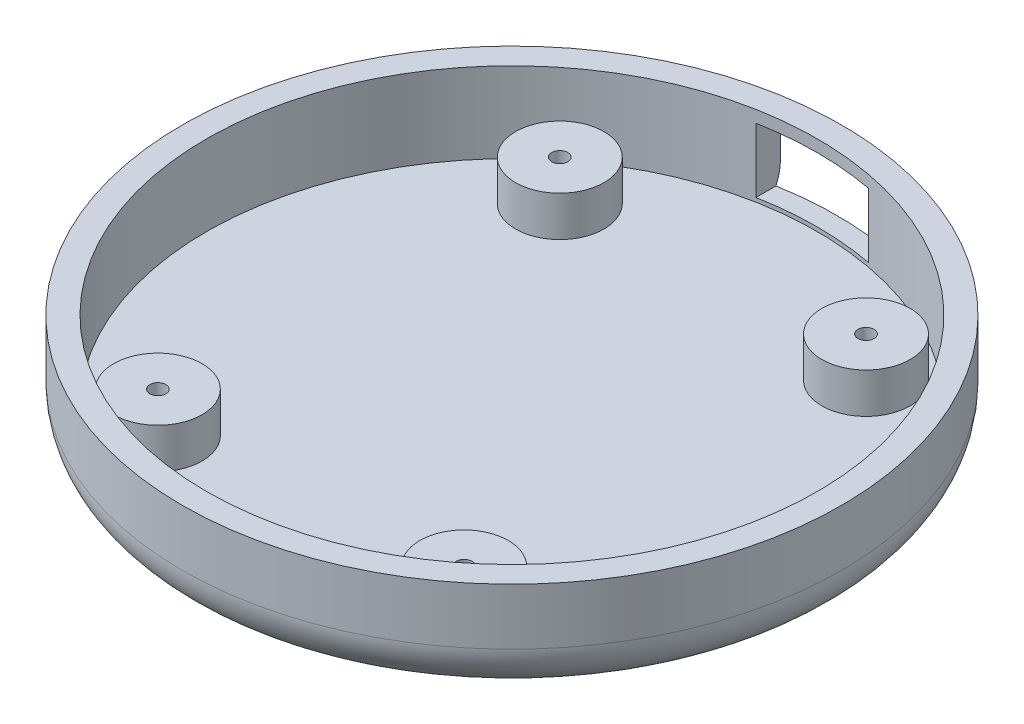
ISO-10303-21;
HEADER;
FILE_DESCRIPTION(('STEP AP214'),'2;1');
FILE_NAME('part.step','',(''),(''),'','','');
FILE_SCHEMA(('AUTOMOTIVE_DESIGN { 1 0 10303 214 1 1 1 1 }'));
ENDSEC;
DATA;
#1=APPLICATION_CONTEXT('core data for automotive mechanical design processes');
#2=APPLICATION_PROTOCOL_DEFINITION('international standard','automotive_design',2000,#1);
#3=PRODUCT_CONTEXT('',#1,'mechanical');
#4=PRODUCT('Part','Part','',(#3));
#5=PRODUCT_RELATED_PRODUCT_CATEGORY('part','',(#4));
#6=PRODUCT_DEFINITION_FORMATION('','',#4);
#7=PRODUCT_DEFINITION_CONTEXT('part definition',#1,'design');
#8=PRODUCT_DEFINITION('design','',#6,#7);
#9=PRODUCT_DEFINITION_SHAPE('','',#8);
#10=(LENGTH_UNIT() NAMED_UNIT(*) SI_UNIT(.MILLI.,.METRE.));
#11=(NAMED_UNIT(*) PLANE_ANGLE_UNIT() SI_UNIT($,.RADIAN.));
#12=(NAMED_UNIT(*) SI_UNIT($,.STERADIAN.) SOLID_ANGLE_UNIT());
#13=UNCERTAINTY_MEASURE_WITH_UNIT(LENGTH_MEASURE(1.E-05),#10,'distance_accuracy_value','');
#14=(GEOMETRIC_REPRESENTATION_CONTEXT(3) GLOBAL_UNCERTAINTY_ASSIGNED_CONTEXT((#13)) GLOBAL_UNIT_ASSIGNED_CONTEXT((#10,
#11,#12)) REPRESENTATION_CONTEXT('',''));
#15=CARTESIAN_POINT('',(0.,0.,0.));
#16=DIRECTION('',(0.,0.,1.));
#17=DIRECTION('',(1.,0.,0.));
#18=AXIS2_PLACEMENT_3D('',#15,#16,#17);
#19=CARTESIAN_POINT('',(0.,3.,0.));
#20=DIRECTION('',(0.,1.,0.));
#21=DIRECTION('',(0.,0.,1.));
#22=AXIS2_PLACEMENT_3D('',#19,#20,#21);
#23=PLANE('',#22);
#24=CARTESIAN_POINT('',(19.0500000000005,3.,25.));
#25=DIRECTION('',(0.,1.,0.));
#26=DIRECTION('',(0.,0.,1.));
#27=AXIS2_PLACEMENT_3D('',#24,#25,#26);
#28=CIRCLE('',#27,5.5);
#29=CARTESIAN_POINT('',(19.0500000000005,3.,30.5));
#30=VERTEX_POINT('',#29);
#31=EDGE_CURVE('E148',#30,#30,#28,.T.);
#32=ORIENTED_EDGE('',*,*,#31,.F.);
#33=EDGE_LOOP('',(#32));
#34=FACE_BOUND('',#33,.T.);
#35=CARTESIAN_POINT('',(-19.0499999999995,3.,25.));
#36=DIRECTION('',(0.,1.,0.));
#37=DIRECTION('',(0.,0.,1.));
#38=AXIS2_PLACEMENT_3D('',#35,#36,#37);
#39=CIRCLE('',#38,5.5);
#40=CARTESIAN_POINT('',(-19.0499999999995,3.,30.5));
#41=VERTEX_POINT('',#40);
#42=EDGE_CURVE('E152',#41,#41,#39,.T.);
#43=ORIENTED_EDGE('',*,*,#42,.F.);
#44=EDGE_LOOP('',(#43));
#45=FACE_BOUND('',#44,.T.);
#46=CARTESIAN_POINT('',(19.05,3.,-25.));
#47=DIRECTION('',(0.,1.,0.));
#48=DIRECTION('',(0.,0.,1.));
#49=AXIS2_PLACEMENT_3D('',#46,#47,#48);
#50=CIRCLE('',#49,5.5);
#51=CARTESIAN_POINT('',(19.05,3.,-19.5));
#52=VERTEX_POINT('',#51);
#53=EDGE_CURVE('E158',#52,#52,#50,.T.);
#54=ORIENTED_EDGE('',*,*,#53,.F.);
#55=EDGE_LOOP('',(#54));
#56=FACE_BOUND('',#55,.T.);
#57=CARTESIAN_POINT('',(-19.05,3.,-25.));
#58=DIRECTION('',(0.,1.,0.));
#59=DIRECTION('',(0.,0.,1.));
#60=AXIS2_PLACEMENT_3D('',#57,#58,#59);
#61=CIRCLE('',#60,5.5);
#62=CARTESIAN_POINT('',(-19.05,3.,-19.5));
#63=VERTEX_POINT('',#62);
#64=EDGE_CURVE('E164',#63,#63,#61,.T.);
#65=ORIENTED_EDGE('',*,*,#64,.F.);
#66=EDGE_LOOP('',(#65));
#67=FACE_BOUND('',#66,.T.);
#68=CARTESIAN_POINT('',(0.,3.,0.));
#69=DIRECTION('',(0.,1.,0.));
#70=DIRECTION('',(0.,0.,1.));
#71=AXIS2_PLACEMENT_3D('',#68,#69,#70);
#72=CIRCLE('',#71,38.);
#73=CARTESIAN_POINT('',(0.,3.,38.));
#74=VERTEX_POINT('',#73);
#75=EDGE_CURVE('E190',#74,#74,#72,.F.);
#76=ORIENTED_EDGE('',*,*,#75,.F.);
#77=EDGE_LOOP('',(#76));
#78=FACE_BOUND('',#77,.T.);
#79=ADVANCED_FACE('F33',(#34,#45,#56,#67,#78),#23,.T.);
#80=CARTESIAN_POINT('',(0.,0.,0.));
#81=DIRECTION('',(0.,1.,0.));
#82=DIRECTION('',(0.,0.,1.));
#83=AXIS2_PLACEMENT_3D('',#80,#81,#82);
#84=PLANE('',#83);
#85=CARTESIAN_POINT('',(0.,0.,0.));
#86=DIRECTION('',(0.,1.,0.));
#87=DIRECTION('',(0.,0.,1.));
#88=AXIS2_PLACEMENT_3D('',#85,#86,#87);
#89=CIRCLE('',#88,35.);
#90=CARTESIAN_POINT('',(0.,0.,35.));
#91=VERTEX_POINT('',#90);
#92=EDGE_CURVE('E195',#91,#91,#89,.F.);
#93=ORIENTED_EDGE('',*,*,#92,.T.);
#94=EDGE_LOOP('',(#93));
#95=FACE_BOUND('',#94,.T.);
#96=CARTESIAN_POINT('',(-19.05,0.,-25.));
#97=DIRECTION('',(0.,1.,0.));
#98=DIRECTION('',(0.,0.,1.));
#99=AXIS2_PLACEMENT_3D('',#96,#97,#98);
#100=CIRCLE('',#99,2.5);
#101=CARTESIAN_POINT('',(-19.05,0.,-22.5));
#102=VERTEX_POINT('',#101);
#103=EDGE_CURVE('E187',#102,#102,#100,.T.);
#104=ORIENTED_EDGE('',*,*,#103,.T.);
#105=EDGE_LOOP('',(#104));
#106=FACE_BOUND('',#105,.T.);
#107=CARTESIAN_POINT('',(19.05,0.,-25.));
#108=DIRECTION('',(0.,1.,0.));
#109=DIRECTION('',(0.,0.,1.));
#110=AXIS2_PLACEMENT_3D('',#107,#108,#109);
#111=CIRCLE('',#110,2.5);
#112=CARTESIAN_POINT('',(19.05,0.,-22.5));
#113=VERTEX_POINT('',#112);
#114=EDGE_CURVE('E184',#113,#113,#111,.T.);
#115=ORIENTED_EDGE('',*,*,#114,.T.);
#116=EDGE_LOOP('',(#115));
#117=FACE_BOUND('',#116,.T.);
#118=CARTESIAN_POINT('',(19.0500000000005,0.,25.));
#119=DIRECTION('',(0.,1.,0.));
#120=DIRECTION('',(0.,0.,1.));
#121=AXIS2_PLACEMENT_3D('',#118,#119,#120);
#122=CIRCLE('',#121,2.5);
#123=CARTESIAN_POINT('',(19.0500000000005,0.,27.5));
#124=VERTEX_POINT('',#123);
#125=EDGE_CURVE('E181',#124,#124,#122,.T.);
#126=ORIENTED_EDGE('',*,*,#125,.T.);
#127=EDGE_LOOP('',(#126));
#128=FACE_BOUND('',#127,.T.);
#129=CARTESIAN_POINT('',(-19.0499999999995,0.,25.));
#130=DIRECTION('',(0.,1.,0.));
#131=DIRECTION('',(0.,0.,1.));
#132=AXIS2_PLACEMENT_3D('',#129,#130,#131);
#133=CIRCLE('',#132,2.5);
#134=CARTESIAN_POINT('',(-19.0499999999995,0.,27.5));
#135=VERTEX_POINT('',#134);
#136=EDGE_CURVE('E178',#135,#135,#133,.T.);
#137=ORIENTED_EDGE('',*,*,#136,.T.);
#138=EDGE_LOOP('',(#137));
#139=FACE_BOUND('',#138,.T.);
#140=ADVANCED_FACE('F232',(#95,#106,#117,#128,#139),#84,.F.);
#141=CARTESIAN_POINT('',(0.,3.,0.));
#142=DIRECTION('',(0.,-1.,0.));
#143=DIRECTION('',(0.,0.,-1.));
#144=AXIS2_PLACEMENT_3D('',#141,#142,#143);
#145=CYLINDRICAL_SURFACE('',#144,41.);
#146=CARTESIAN_POINT('',(0.,6.,0.));
#147=DIRECTION('',(0.,1.,0.));
#148=DIRECTION('',(0.,0.,1.));
#149=AXIS2_PLACEMENT_3D('',#146,#147,#148);
#150=CIRCLE('',#149,41.);
#151=CARTESIAN_POINT('',(-7.,6.,-40.3980197534483));
#152=VERTEX_POINT('',#151);
#153=CARTESIAN_POINT('',(7.,6.,-40.3980197534483));
#154=VERTEX_POINT('',#153);
#155=EDGE_CURVE('E193',#152,#154,#150,.T.);
#156=ORIENTED_EDGE('',*,*,#155,.T.);
#157=DIRECTION('',(0.,-1.,0.));
#158=VECTOR('',#157,1.);
#159=CARTESIAN_POINT('',(7.,3.,-40.3980197534483));
#160=LINE('',#159,#158);
#161=CARTESIAN_POINT('',(7.,11.5,-40.3980197534483));
#162=VERTEX_POINT('',#161);
#163=EDGE_CURVE('E87',#154,#162,#160,.F.);
#164=ORIENTED_EDGE('',*,*,#163,.T.);
#165=CARTESIAN_POINT('',(0.,11.5,0.));
#166=DIRECTION('',(0.,1.,0.));
#167=DIRECTION('',(0.,0.,1.));
#168=AXIS2_PLACEMENT_3D('',#165,#166,#167);
#169=CIRCLE('',#168,41.);
#170=CARTESIAN_POINT('',(-7.,11.5,-40.3980197534483));
#171=VERTEX_POINT('',#170);
#172=EDGE_CURVE('E80',#162,#171,#169,.T.);
#173=ORIENTED_EDGE('',*,*,#172,.T.);
#174=DIRECTION('',(0.,-1.,0.));
#175=VECTOR('',#174,1.);
#176=CARTESIAN_POINT('',(-7.,3.,-40.3980197534483));
#177=LINE('',#176,#175);
#178=EDGE_CURVE('E85',#171,#152,#177,.T.);
#179=ORIENTED_EDGE('',*,*,#178,.T.);
#180=EDGE_LOOP('',(#156,#164,#173,#179));
#181=FACE_BOUND('',#180,.T.);
#182=CARTESIAN_POINT('',(0.,13.,0.));
#183=DIRECTION('',(0.,1.,0.));
#184=DIRECTION('',(0.,0.,1.));
#185=AXIS2_PLACEMENT_3D('',#182,#183,#184);
#186=CIRCLE('',#185,41.);
#187=CARTESIAN_POINT('',(0.,13.,41.));
#188=VERTEX_POINT('',#187);
#189=EDGE_CURVE('E175',#188,#188,#186,.T.);
#190=ORIENTED_EDGE('',*,*,#189,.F.);
#191=EDGE_LOOP('',(#190));
#192=FACE_BOUND('',#191,.T.);
#193=ADVANCED_FACE('F83',(#181,#192),#145,.T.);
#194=CARTESIAN_POINT('',(-19.05,3.,-25.));
#195=DIRECTION('',(0.,-1.,0.));
#196=DIRECTION('',(0.,0.,-1.));
#197=AXIS2_PLACEMENT_3D('',#194,#195,#196);
#198=CYLINDRICAL_SURFACE('',#197,2.5);
#199=ORIENTED_EDGE('',*,*,#103,.F.);
#200=EDGE_LOOP('',(#199));
#201=FACE_BOUND('',#200,.T.);
#202=CARTESIAN_POINT('',(-19.05,6.,-25.));
#203=DIRECTION('',(0.,1.,0.));
#204=DIRECTION('',(0.,0.,1.));
#205=AXIS2_PLACEMENT_3D('',#202,#203,#204);
#206=CIRCLE('',#205,2.5);
#207=CARTESIAN_POINT('',(-19.05,6.,-22.5));
#208=VERTEX_POINT('',#207);
#209=EDGE_CURVE('E167',#208,#208,#206,.F.);
#210=ORIENTED_EDGE('',*,*,#209,.F.);
#211=EDGE_LOOP('',(#210));
#212=FACE_BOUND('',#211,.T.);
#213=ADVANCED_FACE('F275',(#201,#212),#198,.F.);
#214=CARTESIAN_POINT('',(19.05,3.,-25.));
#215=DIRECTION('',(0.,-1.,0.));
#216=DIRECTION('',(0.,0.,-1.));
#217=AXIS2_PLACEMENT_3D('',#214,#215,#216);
#218=CYLINDRICAL_SURFACE('',#217,2.5);
#219=ORIENTED_EDGE('',*,*,#114,.F.);
#220=EDGE_LOOP('',(#219));
#221=FACE_BOUND('',#220,.T.);
#222=CARTESIAN_POINT('',(19.05,6.,-25.));
#223=DIRECTION('',(0.,1.,0.));
#224=DIRECTION('',(0.,0.,1.));
#225=AXIS2_PLACEMENT_3D('',#222,#223,#224);
#226=CIRCLE('',#225,2.5);
#227=CARTESIAN_POINT('',(19.05,6.,-22.5));
#228=VERTEX_POINT('',#227);
#229=EDGE_CURVE('E161',#228,#228,#226,.F.);
#230=ORIENTED_EDGE('',*,*,#229,.F.);
#231=EDGE_LOOP('',(#230));
#232=FACE_BOUND('',#231,.T.);
#233=ADVANCED_FACE('F282',(#221,#232),#218,.F.);
#234=CARTESIAN_POINT('',(19.0500000000005,3.,25.));
#235=DIRECTION('',(0.,-1.,0.));
#236=DIRECTION('',(0.,0.,-1.));
#237=AXIS2_PLACEMENT_3D('',#234,#235,#236);
#238=CYLINDRICAL_SURFACE('',#237,2.5);
#239=ORIENTED_EDGE('',*,*,#125,.F.);
#240=EDGE_LOOP('',(#239));
#241=FACE_BOUND('',#240,.T.);
#242=CARTESIAN_POINT('',(19.0500000000005,6.,25.));
#243=DIRECTION('',(0.,1.,0.));
#244=DIRECTION('',(0.,0.,1.));
#245=AXIS2_PLACEMENT_3D('',#242,#243,#244);
#246=CIRCLE('',#245,2.5);
#247=CARTESIAN_POINT('',(19.0500000000005,6.,27.5));
#248=VERTEX_POINT('',#247);
#249=EDGE_CURVE('E149',#248,#248,#246,.F.);
#250=ORIENTED_EDGE('',*,*,#249,.F.);
#251=EDGE_LOOP('',(#250));
#252=FACE_BOUND('',#251,.T.);
#253=ADVANCED_FACE('F248',(#241,#252),#238,.F.);
#254=CARTESIAN_POINT('',(-19.0499999999995,3.,25.));
#255=DIRECTION('',(0.,-1.,0.));
#256=DIRECTION('',(0.,0.,-1.));
#257=AXIS2_PLACEMENT_3D('',#254,#255,#256);
#258=CYLINDRICAL_SURFACE('',#257,2.5);
#259=ORIENTED_EDGE('',*,*,#136,.F.);
#260=EDGE_LOOP('',(#259));
#261=FACE_BOUND('',#260,.T.);
#262=CARTESIAN_POINT('',(-19.0499999999995,6.,25.));
#263=DIRECTION('',(0.,1.,0.));
#264=DIRECTION('',(0.,0.,1.));
#265=AXIS2_PLACEMENT_3D('',#262,#263,#264);
#266=CIRCLE('',#265,2.5);
#267=CARTESIAN_POINT('',(-19.0499999999995,6.,27.5));
#268=VERTEX_POINT('',#267);
#269=EDGE_CURVE('E155',#268,#268,#266,.F.);
#270=ORIENTED_EDGE('',*,*,#269,.F.);
#271=EDGE_LOOP('',(#270));
#272=FACE_BOUND('',#271,.T.);
#273=ADVANCED_FACE('F244',(#261,#272),#258,.F.);
#274=CARTESIAN_POINT('',(0.,13.,0.));
#275=DIRECTION('',(0.,-1.,0.));
#276=DIRECTION('',(0.,0.,-1.));
#277=AXIS2_PLACEMENT_3D('',#274,#275,#276);
#278=CYLINDRICAL_SURFACE('',#277,38.);
#279=DIRECTION('',(0.,-1.,0.));
#280=VECTOR('',#279,1.);
#281=CARTESIAN_POINT('',(7.,13.,-37.3496987939662));
#282=LINE('',#281,#280);
#283=CARTESIAN_POINT('',(7.,3.5,-37.3496987939662));
#284=VERTEX_POINT('',#283);
#285=CARTESIAN_POINT('',(7.,11.5,-37.3496987939662));
#286=VERTEX_POINT('',#285);
#287=EDGE_CURVE('E90',#284,#286,#282,.F.);
#288=ORIENTED_EDGE('',*,*,#287,.F.);
#289=CARTESIAN_POINT('',(0.,3.5,0.));
#290=DIRECTION('',(0.,-1.,0.));
#291=DIRECTION('',(1.,0.,0.));
#292=AXIS2_PLACEMENT_3D('',#289,#290,#291);
#293=CIRCLE('',#292,38.);
#294=CARTESIAN_POINT('',(-7.,3.50000000000001,-37.3496987939662));
#295=VERTEX_POINT('',#294);
#296=EDGE_CURVE('E109',#295,#284,#293,.T.);
#297=ORIENTED_EDGE('',*,*,#296,.F.);
#298=DIRECTION('',(0.,-1.,0.));
#299=VECTOR('',#298,1.);
#300=CARTESIAN_POINT('',(-7.,13.,-37.3496987939662));
#301=LINE('',#300,#299);
#302=CARTESIAN_POINT('',(-7.,11.5,-37.3496987939662));
#303=VERTEX_POINT('',#302);
#304=EDGE_CURVE('E98',#303,#295,#301,.T.);
#305=ORIENTED_EDGE('',*,*,#304,.F.);
#306=CARTESIAN_POINT('',(0.,11.5,0.));
#307=DIRECTION('',(0.,1.,0.));
#308=DIRECTION('',(0.,0.,1.));
#309=AXIS2_PLACEMENT_3D('',#306,#307,#308);
#310=CIRCLE('',#309,38.);
#311=EDGE_CURVE('E11',#286,#303,#310,.T.);
#312=ORIENTED_EDGE('',*,*,#311,.F.);
#313=EDGE_LOOP('',(#288,#297,#305,#312));
#314=FACE_BOUND('',#313,.T.);
#315=CARTESIAN_POINT('',(0.,13.,0.));
#316=DIRECTION('',(0.,1.,0.));
#317=DIRECTION('',(0.,0.,1.));
#318=AXIS2_PLACEMENT_3D('',#315,#316,#317);
#319=CIRCLE('',#318,38.);
#320=CARTESIAN_POINT('',(0.,13.,38.));
#321=VERTEX_POINT('',#320);
#322=EDGE_CURVE('E170',#321,#321,#319,.T.);
#323=ORIENTED_EDGE('',*,*,#322,.T.);
#324=EDGE_LOOP('',(#323));
#325=FACE_BOUND('',#324,.T.);
#326=ORIENTED_EDGE('',*,*,#75,.T.);
#327=EDGE_LOOP('',(#326));
#328=FACE_BOUND('',#327,.T.);
#329=ADVANCED_FACE('F247',(#314,#325,#328),#278,.F.);
#330=CARTESIAN_POINT('',(0.,13.,0.));
#331=DIRECTION('',(0.,1.,0.));
#332=DIRECTION('',(0.,0.,1.));
#333=AXIS2_PLACEMENT_3D('',#330,#331,#332);
#334=PLANE('',#333);
#335=ORIENTED_EDGE('',*,*,#322,.F.);
#336=EDGE_LOOP('',(#335));
#337=FACE_BOUND('',#336,.T.);
#338=ORIENTED_EDGE('',*,*,#189,.T.);
#339=EDGE_LOOP('',(#338));
#340=FACE_BOUND('',#339,.T.);
#341=ADVANCED_FACE('F319',(#337,#340),#334,.T.);
#342=CARTESIAN_POINT('',(-19.05,6.,-25.));
#343=DIRECTION('',(0.,-1.,0.));
#344=DIRECTION('',(0.,0.,-1.));
#345=AXIS2_PLACEMENT_3D('',#342,#343,#344);
#346=CYLINDRICAL_SURFACE('',#345,5.5);
#347=ORIENTED_EDGE('',*,*,#64,.T.);
#348=EDGE_LOOP('',(#347));
#349=FACE_BOUND('',#348,.T.);
#350=CARTESIAN_POINT('',(-19.05,8.,-25.));
#351=DIRECTION('',(0.,1.,0.));
#352=DIRECTION('',(0.,0.,1.));
#353=AXIS2_PLACEMENT_3D('',#350,#351,#352);
#354=CIRCLE('',#353,5.5);
#355=CARTESIAN_POINT('',(-19.05,8.,-19.5));
#356=VERTEX_POINT('',#355);
#357=EDGE_CURVE('E143',#356,#356,#354,.T.);
#358=ORIENTED_EDGE('',*,*,#357,.F.);
#359=EDGE_LOOP('',(#358));
#360=FACE_BOUND('',#359,.T.);
#361=ADVANCED_FACE('F315',(#349,#360),#346,.T.);
#362=CARTESIAN_POINT('',(19.05,6.,-25.));
#363=DIRECTION('',(0.,-1.,0.));
#364=DIRECTION('',(0.,0.,-1.));
#365=AXIS2_PLACEMENT_3D('',#362,#363,#364);
#366=CYLINDRICAL_SURFACE('',#365,5.5);
#367=ORIENTED_EDGE('',*,*,#53,.T.);
#368=EDGE_LOOP('',(#367));
#369=FACE_BOUND('',#368,.T.);
#370=CARTESIAN_POINT('',(19.05,8.,-25.));
#371=DIRECTION('',(0.,1.,0.));
#372=DIRECTION('',(0.,0.,1.));
#373=AXIS2_PLACEMENT_3D('',#370,#371,#372);
#374=CIRCLE('',#373,5.5);
#375=CARTESIAN_POINT('',(19.05,8.,-19.5));
#376=VERTEX_POINT('',#375);
#377=EDGE_CURVE('E134',#376,#376,#374,.T.);
#378=ORIENTED_EDGE('',*,*,#377,.F.);
#379=EDGE_LOOP('',(#378));
#380=FACE_BOUND('',#379,.T.);
#381=ADVANCED_FACE('F311',(#369,#380),#366,.T.);
#382=CARTESIAN_POINT('',(-19.0499999999995,6.,25.));
#383=DIRECTION('',(0.,-1.,0.));
#384=DIRECTION('',(0.,0.,-1.));
#385=AXIS2_PLACEMENT_3D('',#382,#383,#384);
#386=CYLINDRICAL_SURFACE('',#385,5.5);
#387=ORIENTED_EDGE('',*,*,#42,.T.);
#388=EDGE_LOOP('',(#387));
#389=FACE_BOUND('',#388,.T.);
#390=CARTESIAN_POINT('',(-19.0499999999995,8.,25.));
#391=DIRECTION('',(0.,1.,0.));
#392=DIRECTION('',(0.,0.,1.));
#393=AXIS2_PLACEMENT_3D('',#390,#391,#392);
#394=CIRCLE('',#393,5.5);
#395=CARTESIAN_POINT('',(-19.0499999999995,8.,30.5));
#396=VERTEX_POINT('',#395);
#397=EDGE_CURVE('E116',#396,#396,#394,.T.);
#398=ORIENTED_EDGE('',*,*,#397,.F.);
#399=EDGE_LOOP('',(#398));
#400=FACE_BOUND('',#399,.T.);
#401=ADVANCED_FACE('F304',(#389,#400),#386,.T.);
#402=CARTESIAN_POINT('',(19.0500000000005,6.,25.));
#403=DIRECTION('',(0.,-1.,0.));
#404=DIRECTION('',(0.,0.,-1.));
#405=AXIS2_PLACEMENT_3D('',#402,#403,#404);
#406=CYLINDRICAL_SURFACE('',#405,5.5);
#407=ORIENTED_EDGE('',*,*,#31,.T.);
#408=EDGE_LOOP('',(#407));
#409=FACE_BOUND('',#408,.T.);
#410=CARTESIAN_POINT('',(19.0500000000005,8.,25.));
#411=DIRECTION('',(0.,1.,0.));
#412=DIRECTION('',(0.,0.,1.));
#413=AXIS2_PLACEMENT_3D('',#410,#411,#412);
#414=CIRCLE('',#413,5.5);
#415=CARTESIAN_POINT('',(19.0500000000005,8.,30.5));
#416=VERTEX_POINT('',#415);
#417=EDGE_CURVE('E125',#416,#416,#414,.T.);
#418=ORIENTED_EDGE('',*,*,#417,.F.);
#419=EDGE_LOOP('',(#418));
#420=FACE_BOUND('',#419,.T.);
#421=ADVANCED_FACE('F294',(#409,#420),#406,.T.);
#422=CARTESIAN_POINT('',(-19.05,6.,-25.));
#423=DIRECTION('',(0.,1.,0.));
#424=DIRECTION('',(0.,0.,1.));
#425=AXIS2_PLACEMENT_3D('',#422,#423,#424);
#426=PLANE('',#425);
#427=CARTESIAN_POINT('',(-19.05,6.,-25.));
#428=DIRECTION('',(0.,1.,0.));
#429=DIRECTION('',(0.,0.,1.));
#430=AXIS2_PLACEMENT_3D('',#427,#428,#429);
#431=CIRCLE('',#430,1.);
#432=CARTESIAN_POINT('',(-19.05,6.,-24.));
#433=VERTEX_POINT('',#432);
#434=EDGE_CURVE('E139',#433,#433,#431,.T.);
#435=ORIENTED_EDGE('',*,*,#434,.T.);
#436=EDGE_LOOP('',(#435));
#437=FACE_BOUND('',#436,.T.);
#438=ORIENTED_EDGE('',*,*,#209,.T.);
#439=EDGE_LOOP('',(#438));
#440=FACE_BOUND('',#439,.T.);
#441=ADVANCED_FACE('F291',(#437,#440),#426,.F.);
#442=CARTESIAN_POINT('',(-19.05,8.,-25.));
#443=DIRECTION('',(0.,1.,0.));
#444=DIRECTION('',(0.,0.,1.));
#445=AXIS2_PLACEMENT_3D('',#442,#443,#444);
#446=PLANE('',#445);
#447=ORIENTED_EDGE('',*,*,#357,.T.);
#448=EDGE_LOOP('',(#447));
#449=FACE_BOUND('',#448,.T.);
#450=CARTESIAN_POINT('',(-19.05,8.,-25.));
#451=DIRECTION('',(0.,1.,0.));
#452=DIRECTION('',(0.,0.,1.));
#453=AXIS2_PLACEMENT_3D('',#450,#451,#452);
#454=CIRCLE('',#453,1.);
#455=CARTESIAN_POINT('',(-19.05,8.,-24.));
#456=VERTEX_POINT('',#455);
#457=EDGE_CURVE('E140',#456,#456,#454,.T.);
#458=ORIENTED_EDGE('',*,*,#457,.F.);
#459=EDGE_LOOP('',(#458));
#460=FACE_BOUND('',#459,.T.);
#461=ADVANCED_FACE('F293',(#449,#460),#446,.T.);
#462=CARTESIAN_POINT('',(-19.05,8.,-25.));
#463=DIRECTION('',(0.,-1.,0.));
#464=DIRECTION('',(0.,0.,-1.));
#465=AXIS2_PLACEMENT_3D('',#462,#463,#464);
#466=CYLINDRICAL_SURFACE('',#465,1.);
#467=ORIENTED_EDGE('',*,*,#457,.T.);
#468=EDGE_LOOP('',(#467));
#469=FACE_BOUND('',#468,.T.);
#470=ORIENTED_EDGE('',*,*,#434,.F.);
#471=EDGE_LOOP('',(#470));
#472=FACE_BOUND('',#471,.T.);
#473=ADVANCED_FACE('F301',(#469,#472),#466,.F.);
#474=CARTESIAN_POINT('',(19.05,6.,-25.));
#475=DIRECTION('',(0.,1.,0.));
#476=DIRECTION('',(0.,0.,1.));
#477=AXIS2_PLACEMENT_3D('',#474,#475,#476);
#478=PLANE('',#477);
#479=CARTESIAN_POINT('',(19.05,6.,-25.));
#480=DIRECTION('',(0.,1.,0.));
#481=DIRECTION('',(0.,0.,1.));
#482=AXIS2_PLACEMENT_3D('',#479,#480,#481);
#483=CIRCLE('',#482,1.);
#484=CARTESIAN_POINT('',(19.05,6.,-24.));
#485=VERTEX_POINT('',#484);
#486=EDGE_CURVE('E130',#485,#485,#483,.T.);
#487=ORIENTED_EDGE('',*,*,#486,.T.);
#488=EDGE_LOOP('',(#487));
#489=FACE_BOUND('',#488,.T.);
#490=ORIENTED_EDGE('',*,*,#229,.T.);
#491=EDGE_LOOP('',(#490));
#492=FACE_BOUND('',#491,.T.);
#493=ADVANCED_FACE('F350',(#489,#492),#478,.F.);
#494=CARTESIAN_POINT('',(19.05,8.,-25.));
#495=DIRECTION('',(0.,1.,0.));
#496=DIRECTION('',(0.,0.,1.));
#497=AXIS2_PLACEMENT_3D('',#494,#495,#496);
#498=PLANE('',#497);
#499=ORIENTED_EDGE('',*,*,#377,.T.);
#500=EDGE_LOOP('',(#499));
#501=FACE_BOUND('',#500,.T.);
#502=CARTESIAN_POINT('',(19.05,8.,-25.));
#503=DIRECTION('',(0.,1.,0.));
#504=DIRECTION('',(0.,0.,1.));
#505=AXIS2_PLACEMENT_3D('',#502,#503,#504);
#506=CIRCLE('',#505,1.);
#507=CARTESIAN_POINT('',(19.05,8.,-24.));
#508=VERTEX_POINT('',#507);
#509=EDGE_CURVE('E131',#508,#508,#506,.T.);
#510=ORIENTED_EDGE('',*,*,#509,.F.);
#511=EDGE_LOOP('',(#510));
#512=FACE_BOUND('',#511,.T.);
#513=ADVANCED_FACE('F344',(#501,#512),#498,.T.);
#514=CARTESIAN_POINT('',(19.05,8.,-25.));
#515=DIRECTION('',(0.,-1.,0.));
#516=DIRECTION('',(0.,0.,-1.));
#517=AXIS2_PLACEMENT_3D('',#514,#515,#516);
#518=CYLINDRICAL_SURFACE('',#517,1.);
#519=ORIENTED_EDGE('',*,*,#509,.T.);
#520=EDGE_LOOP('',(#519));
#521=FACE_BOUND('',#520,.T.);
#522=ORIENTED_EDGE('',*,*,#486,.F.);
#523=EDGE_LOOP('',(#522));
#524=FACE_BOUND('',#523,.T.);
#525=ADVANCED_FACE('F335',(#521,#524),#518,.F.);
#526=CARTESIAN_POINT('',(19.0500000000005,6.,25.));
#527=DIRECTION('',(0.,1.,0.));
#528=DIRECTION('',(0.,0.,1.));
#529=AXIS2_PLACEMENT_3D('',#526,#527,#528);
#530=PLANE('',#529);
#531=CARTESIAN_POINT('',(19.0500000000005,6.,25.));
#532=DIRECTION('',(0.,1.,0.));
#533=DIRECTION('',(0.,0.,1.));
#534=AXIS2_PLACEMENT_3D('',#531,#532,#533);
#535=CIRCLE('',#534,1.);
#536=CARTESIAN_POINT('',(19.0500000000005,6.,26.));
#537=VERTEX_POINT('',#536);
#538=EDGE_CURVE('E121',#537,#537,#535,.T.);
#539=ORIENTED_EDGE('',*,*,#538,.T.);
#540=EDGE_LOOP('',(#539));
#541=FACE_BOUND('',#540,.T.);
#542=ORIENTED_EDGE('',*,*,#249,.T.);
#543=EDGE_LOOP('',(#542));
#544=FACE_BOUND('',#543,.T.);
#545=ADVANCED_FACE('F333',(#541,#544),#530,.F.);
#546=CARTESIAN_POINT('',(19.0500000000005,8.,25.));
#547=DIRECTION('',(0.,1.,0.));
#548=DIRECTION('',(0.,0.,1.));
#549=AXIS2_PLACEMENT_3D('',#546,#547,#548);
#550=PLANE('',#549);
#551=ORIENTED_EDGE('',*,*,#417,.T.);
#552=EDGE_LOOP('',(#551));
#553=FACE_BOUND('',#552,.T.);
#554=CARTESIAN_POINT('',(19.0500000000005,8.,25.));
#555=DIRECTION('',(0.,1.,0.));
#556=DIRECTION('',(0.,0.,1.));
#557=AXIS2_PLACEMENT_3D('',#554,#555,#556);
#558=CIRCLE('',#557,1.);
#559=CARTESIAN_POINT('',(19.0500000000005,8.,26.));
#560=VERTEX_POINT('',#559);
#561=EDGE_CURVE('E122',#560,#560,#558,.T.);
#562=ORIENTED_EDGE('',*,*,#561,.F.);
#563=EDGE_LOOP('',(#562));
#564=FACE_BOUND('',#563,.T.);
#565=ADVANCED_FACE('F263',(#553,#564),#550,.T.);
#566=CARTESIAN_POINT('',(19.0500000000005,8.,25.));
#567=DIRECTION('',(0.,-1.,0.));
#568=DIRECTION('',(0.,0.,-1.));
#569=AXIS2_PLACEMENT_3D('',#566,#567,#568);
#570=CYLINDRICAL_SURFACE('',#569,1.);
#571=ORIENTED_EDGE('',*,*,#561,.T.);
#572=EDGE_LOOP('',(#571));
#573=FACE_BOUND('',#572,.T.);
#574=ORIENTED_EDGE('',*,*,#538,.F.);
#575=EDGE_LOOP('',(#574));
#576=FACE_BOUND('',#575,.T.);
#577=ADVANCED_FACE('F255',(#573,#576),#570,.F.);
#578=CARTESIAN_POINT('',(-19.0499999999995,6.,25.));
#579=DIRECTION('',(0.,1.,0.));
#580=DIRECTION('',(0.,0.,1.));
#581=AXIS2_PLACEMENT_3D('',#578,#579,#580);
#582=PLANE('',#581);
#583=CARTESIAN_POINT('',(-19.0499999999995,6.,25.));
#584=DIRECTION('',(0.,1.,0.));
#585=DIRECTION('',(0.,0.,1.));
#586=AXIS2_PLACEMENT_3D('',#583,#584,#585);
#587=CIRCLE('',#586,1.);
#588=CARTESIAN_POINT('',(-19.0499999999995,6.,26.));
#589=VERTEX_POINT('',#588);
#590=EDGE_CURVE('E89',#589,#589,#587,.T.);
#591=ORIENTED_EDGE('',*,*,#590,.T.);
#592=EDGE_LOOP('',(#591));
#593=FACE_BOUND('',#592,.T.);
#594=ORIENTED_EDGE('',*,*,#269,.T.);
#595=EDGE_LOOP('',(#594));
#596=FACE_BOUND('',#595,.T.);
#597=ADVANCED_FACE('F252',(#593,#596),#582,.F.);
#598=CARTESIAN_POINT('',(-19.0499999999995,8.,25.));
#599=DIRECTION('',(0.,1.,0.));
#600=DIRECTION('',(0.,0.,1.));
#601=AXIS2_PLACEMENT_3D('',#598,#599,#600);
#602=PLANE('',#601);
#603=ORIENTED_EDGE('',*,*,#397,.T.);
#604=EDGE_LOOP('',(#603));
#605=FACE_BOUND('',#604,.T.);
#606=CARTESIAN_POINT('',(-19.0499999999995,8.,25.));
#607=DIRECTION('',(0.,1.,0.));
#608=DIRECTION('',(0.,0.,1.));
#609=AXIS2_PLACEMENT_3D('',#606,#607,#608);
#610=CIRCLE('',#609,1.);
#611=CARTESIAN_POINT('',(-19.0499999999995,8.,26.));
#612=VERTEX_POINT('',#611);
#613=EDGE_CURVE('E113',#612,#612,#610,.T.);
#614=ORIENTED_EDGE('',*,*,#613,.F.);
#615=EDGE_LOOP('',(#614));
#616=FACE_BOUND('',#615,.T.);
#617=ADVANCED_FACE('F254',(#605,#616),#602,.T.);
#618=CARTESIAN_POINT('',(-19.0499999999995,8.,25.));
#619=DIRECTION('',(0.,-1.,0.));
#620=DIRECTION('',(0.,0.,-1.));
#621=AXIS2_PLACEMENT_3D('',#618,#619,#620);
#622=CYLINDRICAL_SURFACE('',#621,1.);
#623=ORIENTED_EDGE('',*,*,#613,.T.);
#624=EDGE_LOOP('',(#623));
#625=FACE_BOUND('',#624,.T.);
#626=ORIENTED_EDGE('',*,*,#590,.F.);
#627=EDGE_LOOP('',(#626));
#628=FACE_BOUND('',#627,.T.);
#629=ADVANCED_FACE('F216',(#625,#628),#622,.F.);
#630=CARTESIAN_POINT('',(0.,6.,0.));
#631=DIRECTION('',(0.,1.,0.));
#632=DIRECTION('',(0.,0.,1.));
#633=AXIS2_PLACEMENT_3D('',#630,#631,#632);
#634=TOROIDAL_SURFACE('',#633,35.,6.);
#635=CARTESIAN_POINT('',(7.,4.22374927657882,-40.1250349392885));
#636=CARTESIAN_POINT('',(7.,4.06340233332482,-40.0745883421306));
#637=CARTESIAN_POINT('',(7.,3.90521720009159,-40.0173260538921));
#638=CARTESIAN_POINT('',(7.,3.59421509082321,-39.8895849067458));
#639=CARTESIAN_POINT('',(7.,3.44139966617515,-39.8191022649623));
#640=CARTESIAN_POINT('',(7.,3.14213210367637,-39.6653984014818));
#641=CARTESIAN_POINT('',(7.,2.99568626806854,-39.5821649160386));
#642=CARTESIAN_POINT('',(7.,2.71028543033757,-39.4036079710643));
#643=CARTESIAN_POINT('',(7.,2.57133323283013,-39.3082800291265));
#644=CARTESIAN_POINT('',(7.,2.30212973234211,-39.1064184917139));
#645=CARTESIAN_POINT('',(7.,2.17186646258622,-38.9999008508861));
#646=CARTESIAN_POINT('',(7.,1.9206647489392,-38.7762987875569));
#647=CARTESIAN_POINT('',(7.,1.79972975186801,-38.6592104935289));
#648=CARTESIAN_POINT('',(7.,1.56811674964052,-38.4154350496769));
#649=CARTESIAN_POINT('',(7.,1.45743241844742,-38.2887539088682));
#650=CARTESIAN_POINT('',(7.,1.2469201467999,-38.0265961512476));
#651=CARTESIAN_POINT('',(7.,1.14709626664075,-37.8911162749576));
#652=CARTESIAN_POINT('',(7.,0.958063458068447,-37.6109950682451));
#653=CARTESIAN_POINT('',(7.,0.868968788489657,-37.4662766336344));
#654=CARTESIAN_POINT('',(7.,0.70308770717286,-37.1698820867602));
#655=CARTESIAN_POINT('',(7.,0.626305837089719,-37.0182034335863));
#656=CARTESIAN_POINT('',(7.,0.485584452920314,-36.7090508376668));
#657=CARTESIAN_POINT('',(7.,0.421641580724581,-36.5515784230943));
#658=CARTESIAN_POINT('',(7.,0.306936246284918,-36.231840387586));
#659=CARTESIAN_POINT('',(7.,0.256178708744591,-36.0695730008647));
#660=CARTESIAN_POINT('',(7.,0.16745045826127,-35.7387340384482));
#661=CARTESIAN_POINT('',(7.,0.129702137810863,-35.5701027836632));
#662=CARTESIAN_POINT('',(7.,0.0683591416378031,-35.2302258208629));
#663=CARTESIAN_POINT('',(7.,0.0447697216140275,-35.0589791661836));
#664=CARTESIAN_POINT('',(7.,0.0118966717964032,-34.7151577656805));
#665=CARTESIAN_POINT('',(7.,0.00260884620665593,-34.5425834243109));
#666=CARTESIAN_POINT('',(7.,-0.00165871387379107,-34.1972406170495));
#667=CARTESIAN_POINT('',(7.,0.00336687785613488,-34.0244721028144));
#668=CARTESIAN_POINT('',(7.,0.0402407609031646,-33.5029085632088));
#669=CARTESIAN_POINT('',(7.,0.0943219102939039,-33.1554129998042));
#670=CARTESIAN_POINT('',(7.,0.259742139491828,-32.4745054913842));
#671=CARTESIAN_POINT('',(7.,0.371084247270784,-32.1410942921622));
#672=CARTESIAN_POINT('',(7.,0.648727330333508,-31.4961025236877));
#673=CARTESIAN_POINT('',(7.,0.81527779396608,-31.1846289842948));
#674=CARTESIAN_POINT('',(7.,1.19883532885575,-30.5944556026962));
#675=CARTESIAN_POINT('',(7.,1.41584095728576,-30.3157548236564));
#676=CARTESIAN_POINT('',(7.,1.89193548618208,-29.8024797301385));
#677=CARTESIAN_POINT('',(7.,2.15054948893097,-29.5674653655477));
#678=CARTESIAN_POINT('',(7.,2.7044116614062,-29.145495453269));
#679=CARTESIAN_POINT('',(7.,2.99965457839222,-28.9585330265154));
#680=CARTESIAN_POINT('',(7.,3.61069986647689,-28.6429753205655));
#681=CARTESIAN_POINT('',(7.,3.92582200177307,-28.5130632405553));
#682=CARTESIAN_POINT('',(7.,4.57375293874677,-28.3095689709168));
#683=CARTESIAN_POINT('',(7.,4.90655867402507,-28.2359770490416));
#684=CARTESIAN_POINT('',(7.,5.57127444093676,-28.1488901111722));
#685=CARTESIAN_POINT('',(7.,5.902990336886,-28.1339084840055));
#686=CARTESIAN_POINT('',(7.,6.5641360242323,-28.1604531334866));
#687=CARTESIAN_POINT('',(7.,6.8935659879339,-28.2019751035747));
#688=CARTESIAN_POINT('',(7.,7.53752712316039,-28.3394008068617));
#689=CARTESIAN_POINT('',(7.,7.85217115119619,-28.4347774351008));
#690=CARTESIAN_POINT('',(7.,8.46128300205438,-28.6763504786073));
#691=CARTESIAN_POINT('',(7.,8.75574983295042,-28.8225493901939));
#692=CARTESIAN_POINT('',(7.,9.32033662050374,-29.163316168346));
#693=CARTESIAN_POINT('',(7.,9.59009865686867,-29.3584764517857));
#694=CARTESIAN_POINT('',(7.,10.0940905392591,-29.7902523333806));
#695=CARTESIAN_POINT('',(7.,10.3283159546221,-30.0268730928648));
#696=CARTESIAN_POINT('',(7.,10.7610419870713,-30.5413995082471));
#697=CARTESIAN_POINT('',(7.,10.9584592216039,-30.8202163154238));
#698=CARTESIAN_POINT('',(7.,11.3049504621982,-31.4064245338314));
#699=CARTESIAN_POINT('',(7.,11.4540182356315,-31.7138196224631));
#700=CARTESIAN_POINT('',(7.,11.70300950623,-32.3562047939325));
#701=CARTESIAN_POINT('',(7.,11.8017039975813,-32.691671671155));
#702=CARTESIAN_POINT('',(7.,11.941994136865,-33.3743614417432));
#703=CARTESIAN_POINT('',(7.,11.9835857984106,-33.7215851541276));
#704=CARTESIAN_POINT('',(7.,12.008578474331,-34.4215294711788));
#705=CARTESIAN_POINT('',(7.,11.9914010285481,-34.7742705031792));
#706=CARTESIAN_POINT('',(7.,11.8976850421974,-35.4719914143217));
#707=CARTESIAN_POINT('',(7.,11.8211469383141,-35.8169713505388));
#708=CARTESIAN_POINT('',(7.,11.6636535652869,-36.3197708166907));
#709=CARTESIAN_POINT('',(7.,11.6042024047122,-36.4846109303733));
#710=CARTESIAN_POINT('',(7.,11.4714885053045,-36.808613655517));
#711=CARTESIAN_POINT('',(7.,11.3982311411002,-36.9677784477509));
#712=CARTESIAN_POINT('',(7.,11.2383460836686,-37.2793006072003));
#713=CARTESIAN_POINT('',(7.,11.1517138665192,-37.4316556485114));
#714=CARTESIAN_POINT('',(7.,10.9657120523641,-37.7283040990302));
#715=CARTESIAN_POINT('',(7.,10.8663475196668,-37.8726006809198));
#716=CARTESIAN_POINT('',(7.,10.6570358159756,-38.1500978186863));
#717=CARTESIAN_POINT('',(7.,10.5472588596992,-38.2834267927676));
#718=CARTESIAN_POINT('',(7.,10.3167610268927,-38.5401710422795));
#719=CARTESIAN_POINT('',(7.,10.1960445133602,-38.6635902332877));
#720=CARTESIAN_POINT('',(7.,9.94443810807796,-38.8996574635679));
#721=CARTESIAN_POINT('',(7.,9.81354540370742,-39.0123025056238));
#722=CARTESIAN_POINT('',(7.,9.54259924865288,-39.2258640572675));
#723=CARTESIAN_POINT('',(7.,9.40254943790989,-39.3267851833363));
#724=CARTESIAN_POINT('',(7.,9.11664717930486,-39.514584550854));
#725=CARTESIAN_POINT('',(7.,8.97092936643749,-39.6016678068278));
#726=CARTESIAN_POINT('',(7.,8.67266077839569,-39.7630707362855));
#727=CARTESIAN_POINT('',(7.,8.52011271964065,-39.837395428047));
#728=CARTESIAN_POINT('',(7.,8.2091360041999,-39.9727843213173));
#729=CARTESIAN_POINT('',(7.,8.0507040103246,-40.0338408587746));
#730=CARTESIAN_POINT('',(7.,7.72925349497752,-40.1421399779404));
#731=CARTESIAN_POINT('',(7.,7.56623676288756,-40.1893878692205));
#732=CARTESIAN_POINT('',(7.,7.23879309178727,-40.2692309685873));
#733=CARTESIAN_POINT('',(7.,7.07440860917752,-40.3020003685849));
#734=CARTESIAN_POINT('',(7.,6.74351553037768,-40.3534704457673));
#735=CARTESIAN_POINT('',(7.,6.57700776767306,-40.3721764804763));
#736=CARTESIAN_POINT('',(7.,6.24316440455272,-40.395383491763));
#737=CARTESIAN_POINT('',(7.,6.07582975743337,-40.3998981511177));
#738=CARTESIAN_POINT('',(7.,5.74143528907616,-40.3947292049173));
#739=CARTESIAN_POINT('',(7.,5.57437540435827,-40.3850495469682));
#740=CARTESIAN_POINT('',(7.,5.20718942993618,-40.3480979099731));
#741=CARTESIAN_POINT('',(7.,5.00738061720394,-40.317597717803));
#742=CARTESIAN_POINT('',(7.,4.61192542190349,-40.2363519600506));
#743=CARTESIAN_POINT('',(7.,4.41627901080679,-40.1856065332735));
#744=CARTESIAN_POINT('',(7.,4.22374927657882,-40.1250349392885));
#745=B_SPLINE_CURVE_WITH_KNOTS('',3,(#635,#636,#637,#638,#639,#640,#641,#642,#643,#644,#645,
#646,#647,#648,#649,#650,#651,#652,#653,#654,#655,#656,#657,#658,#659,#660,#661,#662,#663,#664,
#665,#666,#667,#668,#669,#670,#671,#672,#673,#674,#675,#676,#677,#678,#679,#680,#681,#682,#683,
#684,#685,#686,#687,#688,#689,#690,#691,#692,#693,#694,#695,#696,#697,#698,#699,#700,#701,#702,
#703,#704,#705,#706,#707,#708,#709,#710,#711,#712,#713,#714,#715,#716,#717,#718,#719,#720,#721,
#722,#723,#724,#725,#726,#727,#728,#729,#730,#731,#732,#733,#734,#735,#736,#737,#738,#739,#740,
#741,#742,#743,#744),.UNSPECIFIED.,.T.,.F.,(4,2,2,2,2,2,2,2,2,2,2,2,2,2,2,2,2,2,2,2,2,2,2,2,2,2,
2,2,2,2,2,2,2,2,2,2,2,2,2,2,2,2,2,2,2,2,2,2,2,2,2,2,2,2,4),(0.,0.504105801592038,
1.00835606882225,1.51309440408591,2.0180203532329,2.5222358902054,3.02663685235663,
3.5307244276799,4.03499981855385,4.54424297923533,5.05367354759057,5.56297069755125,
6.07245779665207,6.590266519821,7.10826733180523,7.6261161439498,8.14415767997623,
9.19380673297647,10.2435112973521,11.2980256939572,12.3525099391424,13.3957165799776,
14.4387737931423,15.456296667097,16.4736436711424,17.4650123351769,18.4563054438598,
19.4380603408261,20.4198634670335,21.414173128492,22.4086066575667,23.4288165743267,
24.4491579520038,25.4933281536872,26.5375712458866,27.5921221983931,28.6466653932091,
29.1718436940655,29.6968179685574,30.2219702014271,30.7469141984141,31.2644076959379,
31.7816957035311,32.299127197337,32.816354248527,33.3250092362537,33.8334636959288,
34.3422110767968,34.8507625807265,35.3530169680637,35.8550799214596,36.3566586563986,
36.8580979228613,37.4633855538959,38.0686690350382),.UNSPECIFIED.);
#746=CARTESIAN_POINT('',(7.,3.5,-39.8441328681181));
#747=VERTEX_POINT('',#746);
#748=EDGE_CURVE('E42',#154,#747,#745,.T.);
#749=ORIENTED_EDGE('',*,*,#748,.F.);
#750=ORIENTED_EDGE('',*,*,#155,.F.);
#751=CARTESIAN_POINT('',(-7.,4.22374927657882,-40.1250349392885));
#752=CARTESIAN_POINT('',(-7.,4.38234414799938,-40.1749329089838));
#753=CARTESIAN_POINT('',(-7.,4.54301749180359,-40.2181513044035));
#754=CARTESIAN_POINT('',(-7.,4.86748183001224,-40.2909333029652));
#755=CARTESIAN_POINT('',(-7.,5.03127358251214,-40.3204935404671));
#756=CARTESIAN_POINT('',(-7.,5.36089765486132,-40.3657305983708));
#757=CARTESIAN_POINT('',(-7.,5.5267315410299,-40.3813959894274));
#758=CARTESIAN_POINT('',(-7.,5.85919118817908,-40.3986867678504));
#759=CARTESIAN_POINT('',(-7.,6.02581721540773,-40.4003070430419));
#760=CARTESIAN_POINT('',(-7.,6.35847758751098,-40.389485724403));
#761=CARTESIAN_POINT('',(-7.,6.52451230012964,-40.3770554240327));
#762=CARTESIAN_POINT('',(-7.,6.85500430804085,-40.3382392425961));
#763=CARTESIAN_POINT('',(-7.,7.01946099905836,-40.3118482168898));
#764=CARTESIAN_POINT('',(-7.,7.34546878046746,-40.2453290327311));
#765=CARTESIAN_POINT('',(-7.,7.50702155632281,-40.2052091327081));
#766=CARTESIAN_POINT('',(-7.,7.82624208324568,-40.1115162632155));
#767=CARTESIAN_POINT('',(-7.,7.98390837438539,-40.0579383204225));
#768=CARTESIAN_POINT('',(-7.,8.29423922129544,-39.9377222530248));
#769=CARTESIAN_POINT('',(-7.,8.44690212182148,-39.8710798562803));
#770=CARTESIAN_POINT('',(-7.,8.74616575640754,-39.725220016125));
#771=CARTESIAN_POINT('',(-7.,8.89276424402909,-39.6459979644947));
#772=CARTESIAN_POINT('',(-7.,9.17878583691001,-39.4756139510046));
#773=CARTESIAN_POINT('',(-7.,9.31821120133853,-39.3844557808799));
#774=CARTESIAN_POINT('',(-7.,9.58904057344808,-39.1908171752074));
#775=CARTESIAN_POINT('',(-7.,9.7204415795506,-39.0883325426918));
#776=CARTESIAN_POINT('',(-7.,9.97531607872406,-38.8719424802374));
#777=CARTESIAN_POINT('',(-7.,10.0987167894875,-38.7579513161083));
#778=CARTESIAN_POINT('',(-7.,10.335634257506,-38.5200456697301));
#779=CARTESIAN_POINT('',(-7.,10.4491473594681,-38.3961275498677));
#780=CARTESIAN_POINT('',(-7.,10.6654651027411,-38.1393282075309));
#781=CARTESIAN_POINT('',(-7.,10.7682731554349,-38.006449862792));
#782=CARTESIAN_POINT('',(-7.,10.9625795480829,-37.7326461123567));
#783=CARTESIAN_POINT('',(-7.,11.0540736575091,-37.5917177251983));
#784=CARTESIAN_POINT('',(-7.,11.3130752515485,-37.1542232289104));
#785=CARTESIAN_POINT('',(-7.,11.4621544825494,-36.846449467046));
#786=CARTESIAN_POINT('',(-7.,11.7074002178433,-36.2106905746503));
#787=CARTESIAN_POINT('',(-7.,11.8035621956091,-35.882703717764));
#788=CARTESIAN_POINT('',(-7.,11.9420289665323,-35.2097901448115));
#789=CARTESIAN_POINT('',(-7.,11.9834076725034,-34.8646720207085));
#790=CARTESIAN_POINT('',(-7.,12.0084400371822,-34.1723552561301));
#791=CARTESIAN_POINT('',(-7.,11.9920887261139,-33.8251564391038));
#792=CARTESIAN_POINT('',(-7.,11.9016846530473,-33.1337497646646));
#793=CARTESIAN_POINT('',(-7.,11.8268856543673,-32.7896392317041));
#794=CARTESIAN_POINT('',(-7.,11.6207234341622,-32.11878116103));
#795=CARTESIAN_POINT('',(-7.,11.4893577384259,-31.7920343835045));
#796=CARTESIAN_POINT('',(-7.,11.1731601780425,-31.1646046532027));
#797=CARTESIAN_POINT('',(-7.,10.9882132961159,-30.8639795971663));
#798=CARTESIAN_POINT('',(-7.,10.569827557172,-30.2985797159763));
#799=CARTESIAN_POINT('',(-7.,10.3363911234926,-30.0338031003352));
#800=CARTESIAN_POINT('',(-7.,9.83080492275671,-29.5517279206498));
#801=CARTESIAN_POINT('',(-7.,9.55922340474498,-29.3338339055956));
#802=CARTESIAN_POINT('',(-7.,8.98252438036119,-28.9481707382057));
#803=CARTESIAN_POINT('',(-7.,8.6774121741074,-28.7803936795427));
#804=CARTESIAN_POINT('',(-7.,8.05076359787935,-28.5044118289192));
#805=CARTESIAN_POINT('',(-7.,7.72985709949458,-28.3947769563484));
#806=CARTESIAN_POINT('',(-7.,7.07396274317249,-28.2324282558558));
#807=CARTESIAN_POINT('',(-7.,6.73897719217329,-28.1797051400838));
#808=CARTESIAN_POINT('',(-7.,6.07299625525182,-28.1336212180156));
#809=CARTESIAN_POINT('',(-7.,5.74209598464971,-28.1388758755183));
#810=CARTESIAN_POINT('',(-7.,5.08596031210348,-28.2052236121298));
#811=CARTESIAN_POINT('',(-7.,4.7607246118081,-28.2663137412821));
#812=CARTESIAN_POINT('',(-7.,4.12695207751981,-28.4417275753719));
#813=CARTESIAN_POINT('',(-7.,3.81833151643273,-28.5557495502262));
#814=CARTESIAN_POINT('',(-7.,3.22417444882584,-28.8331866701217));
#815=CARTESIAN_POINT('',(-7.,2.93863950663929,-28.9966051588319));
#816=CARTESIAN_POINT('',(-7.,2.39368504296283,-29.3707734612409));
#817=CARTESIAN_POINT('',(-7.,2.13476053085909,-29.5822435899665));
#818=CARTESIAN_POINT('',(-7.,1.6549280941965,-30.0446338311101));
#819=CARTESIAN_POINT('',(-7.,1.43402510363924,-30.2955590554902));
#820=CARTESIAN_POINT('',(-7.,1.03032193842556,-30.8368358718609));
#821=CARTESIAN_POINT('',(-7.,0.848691624678207,-31.128058673072));
#822=CARTESIAN_POINT('',(-7.,0.535658417485103,-31.7365462059772));
#823=CARTESIAN_POINT('',(-7.,0.404261746694583,-32.0538141580858));
#824=CARTESIAN_POINT('',(-7.,0.246258863971936,-32.5458054251494));
#825=CARTESIAN_POINT('',(-7.,0.199823146331985,-32.7144148971473));
#826=CARTESIAN_POINT('',(-7.,0.121210650186489,-33.0549091824841));
#827=CARTESIAN_POINT('',(-7.,0.08902890058658,-33.2267928321013));
#828=CARTESIAN_POINT('',(-7.,0.0391410658844138,-33.572710244648));
#829=CARTESIAN_POINT('',(-7.,0.0214410541701783,-33.7467448786357));
#830=CARTESIAN_POINT('',(-7.,0.000672071226064966,-34.0956235712846));
#831=CARTESIAN_POINT('',(-7.,-0.00240230502003154,-34.2704673070213));
#832=CARTESIAN_POINT('',(-7.,0.00614545298269239,-34.6211036365795));
#833=CARTESIAN_POINT('',(-7.,0.0178775552523941,-34.796893560406));
#834=CARTESIAN_POINT('',(-7.,0.0561711288731297,-35.1467853381749));
#835=CARTESIAN_POINT('',(-7.,0.0827270685276373,-35.3208877971745));
#836=CARTESIAN_POINT('',(-7.,0.150530097347071,-35.6662696532728));
#837=CARTESIAN_POINT('',(-7.,0.191782058911646,-35.8375480943521));
#838=CARTESIAN_POINT('',(-7.,0.288710316263208,-36.1759035649238));
#839=CARTESIAN_POINT('',(-7.,0.344380994385538,-36.3429822029474));
#840=CARTESIAN_POINT('',(-7.,0.469365772763713,-36.6706186361397));
#841=CARTESIAN_POINT('',(-7.,0.538581751323825,-36.8312138584154));
#842=CARTESIAN_POINT('',(-7.,0.69042586425748,-37.1458582647045));
#843=CARTESIAN_POINT('',(-7.,0.773048747098919,-37.2999099821399));
#844=CARTESIAN_POINT('',(-7.,0.95123143070635,-37.6004644280964));
#845=CARTESIAN_POINT('',(-7.,1.04679875777495,-37.7469626958761));
#846=CARTESIAN_POINT('',(-7.,1.25014378613333,-38.0311398948375));
#847=CARTESIAN_POINT('',(-7.,1.35791663074448,-38.1688223000256));
#848=CARTESIAN_POINT('',(-7.,1.58328769723504,-38.4324181206558));
#849=CARTESIAN_POINT('',(-7.,1.70071881500083,-38.5584744210353));
#850=CARTESIAN_POINT('',(-7.,1.94587734528609,-38.8000435442416));
#851=CARTESIAN_POINT('',(-7.,2.07360068738855,-38.9155604970531));
#852=CARTESIAN_POINT('',(-7.,2.33835906289436,-39.1351092313702));
#853=CARTESIAN_POINT('',(-7.,2.47538490523504,-39.2391520902063));
#854=CARTESIAN_POINT('',(-7.,2.75782778001299,-39.4350379191568));
#855=CARTESIAN_POINT('',(-7.,2.90324245755712,-39.5268842893647));
#856=CARTESIAN_POINT('',(-7.,3.23763560829508,-39.7184103681729));
#857=CARTESIAN_POINT('',(-7.,3.4286303697833,-39.8145930970166));
#858=CARTESIAN_POINT('',(-7.,3.81985740666182,-39.9858670347791));
#859=CARTESIAN_POINT('',(-7.,4.02008959703092,-40.0609584377772));
#860=CARTESIAN_POINT('',(-7.,4.22374927657882,-40.1250349392885));
#861=B_SPLINE_CURVE_WITH_KNOTS('',3,(#751,#752,#753,#754,#755,#756,#757,#758,#759,#760,#761,
#762,#763,#764,#765,#766,#767,#768,#769,#770,#771,#772,#773,#774,#775,#776,#777,#778,#779,#780,
#781,#782,#783,#784,#785,#786,#787,#788,#789,#790,#791,#792,#793,#794,#795,#796,#797,#798,#799,
#800,#801,#802,#803,#804,#805,#806,#807,#808,#809,#810,#811,#812,#813,#814,#815,#816,#817,#818,
#819,#820,#821,#822,#823,#824,#825,#826,#827,#828,#829,#830,#831,#832,#833,#834,#835,#836,#837,
#838,#839,#840,#841,#842,#843,#844,#845,#846,#847,#848,#849,#850,#851,#852,#853,#854,#855,#856,
#857,#858,#859,#860),.UNSPECIFIED.,.T.,.F.,(4,2,2,2,2,2,2,2,2,2,2,2,2,2,2,2,2,2,2,2,2,2,2,2,2,2,
2,2,2,2,2,2,2,2,2,2,2,2,2,2,2,2,2,2,2,2,2,2,2,2,2,2,2,2,4),(0.,0.498592399607487,
0.997307596807377,1.49643263778213,1.99573934385958,2.49464500635511,2.99373464781863,
3.49252459448471,3.99149913728202,4.49063712016945,4.98995837249801,5.48912138902523,
5.98846999218634,6.49186074827908,6.99543681710802,7.49885191682015,8.00245468874289,
9.02322375397343,10.044080121941,11.0819821722329,12.1199735740774,13.1714385886196,
14.2229495986157,15.2767347200043,16.3304671895697,17.3699023110575,18.4091733671214,
19.421533319387,20.4337280321604,21.4218044206591,22.409828609117,23.3922885964082,
24.3748151016897,25.373175241143,26.371664838927,27.3967147384004,28.4218915740579,
28.9460459209288,29.4700173239128,29.9942083588803,30.5182056599574,31.0461177019373,
31.573832878636,32.1017231799948,32.6294081190138,33.1534032926088,33.6771937087105,
34.2012899907404,34.7251784583179,35.2413906743007,35.7573997288892,36.2729061740733,
36.7882686051539,37.4285421640921,38.0688098311329),.UNSPECIFIED.);
#862=CARTESIAN_POINT('',(-7.,3.50000000000001,-39.8441328681181));
#863=VERTEX_POINT('',#862);
#864=EDGE_CURVE('E97',#863,#152,#861,.T.);
#865=ORIENTED_EDGE('',*,*,#864,.F.);
#866=CARTESIAN_POINT('',(0.,3.50000000000001,0.));
#867=DIRECTION('',(0.,-1.,0.));
#868=DIRECTION('',(1.,0.,0.));
#869=AXIS2_PLACEMENT_3D('',#866,#867,#868);
#870=CIRCLE('',#869,40.4543560573179);
#871=EDGE_CURVE('E203',#747,#863,#870,.F.);
#872=ORIENTED_EDGE('',*,*,#871,.F.);
#873=EDGE_LOOP('',(#749,#750,#865,#872));
#874=FACE_BOUND('',#873,.T.);
#875=ORIENTED_EDGE('',*,*,#92,.F.);
#876=EDGE_LOOP('',(#875));
#877=FACE_BOUND('',#876,.T.);
#878=ADVANCED_FACE('F35',(#874,#877),#634,.T.);
#879=CARTESIAN_POINT('',(-7.,11.5,-41.));
#880=DIRECTION('',(0.,1.,0.));
#881=DIRECTION('',(0.,0.,1.));
#882=AXIS2_PLACEMENT_3D('',#879,#880,#881);
#883=PLANE('',#882);
#884=DIRECTION('',(0.,0.,1.));
#885=VECTOR('',#884,1.);
#886=CARTESIAN_POINT('',(7.,11.5,-41.));
#887=LINE('',#886,#885);
#888=EDGE_CURVE('E48',#162,#286,#887,.T.);
#889=ORIENTED_EDGE('',*,*,#888,.T.);
#890=ORIENTED_EDGE('',*,*,#311,.T.);
#891=DIRECTION('',(0.,0.,1.));
#892=VECTOR('',#891,1.);
#893=CARTESIAN_POINT('',(-7.,11.5,-41.));
#894=LINE('',#893,#892);
#895=EDGE_CURVE('E94',#171,#303,#894,.T.);
#896=ORIENTED_EDGE('',*,*,#895,.F.);
#897=ORIENTED_EDGE('',*,*,#172,.F.);
#898=EDGE_LOOP('',(#889,#890,#896,#897));
#899=FACE_BOUND('',#898,.T.);
#900=ADVANCED_FACE('F101',(#899),#883,.F.);
#901=CARTESIAN_POINT('',(7.,11.5,-41.));
#902=DIRECTION('',(1.,0.,0.));
#903=DIRECTION('',(0.,0.,-1.));
#904=AXIS2_PLACEMENT_3D('',#901,#902,#903);
#905=PLANE('',#904);
#906=ORIENTED_EDGE('',*,*,#287,.T.);
#907=ORIENTED_EDGE('',*,*,#888,.F.);
#908=ORIENTED_EDGE('',*,*,#163,.F.);
#909=ORIENTED_EDGE('',*,*,#748,.T.);
#910=DIRECTION('',(0.,0.,1.));
#911=VECTOR('',#910,1.);
#912=CARTESIAN_POINT('',(7.,3.5,-41.));
#913=LINE('',#912,#911);
#914=EDGE_CURVE('E99',#747,#284,#913,.T.);
#915=ORIENTED_EDGE('',*,*,#914,.T.);
#916=EDGE_LOOP('',(#906,#907,#908,#909,#915));
#917=FACE_BOUND('',#916,.T.);
#918=ADVANCED_FACE('F209',(#917),#905,.F.);
#919=CARTESIAN_POINT('',(-7.,11.5,-41.));
#920=DIRECTION('',(-1.,0.,0.));
#921=DIRECTION('',(0.,-1.,0.));
#922=AXIS2_PLACEMENT_3D('',#919,#920,#921);
#923=PLANE('',#922);
#924=ORIENTED_EDGE('',*,*,#304,.T.);
#925=DIRECTION('',(0.,0.,1.));
#926=VECTOR('',#925,1.);
#927=CARTESIAN_POINT('',(-7.,3.50000000000001,-41.));
#928=LINE('',#927,#926);
#929=EDGE_CURVE('E56',#863,#295,#928,.T.);
#930=ORIENTED_EDGE('',*,*,#929,.F.);
#931=ORIENTED_EDGE('',*,*,#864,.T.);
#932=ORIENTED_EDGE('',*,*,#178,.F.);
#933=ORIENTED_EDGE('',*,*,#895,.T.);
#934=EDGE_LOOP('',(#924,#930,#931,#932,#933));
#935=FACE_BOUND('',#934,.T.);
#936=ADVANCED_FACE('F93',(#935),#923,.F.);
#937=CARTESIAN_POINT('',(-7.,3.50000000000001,-41.));
#938=DIRECTION('',(0.,-1.,0.));
#939=DIRECTION('',(1.,0.,0.));
#940=AXIS2_PLACEMENT_3D('',#937,#938,#939);
#941=PLANE('',#940);
#942=ORIENTED_EDGE('',*,*,#296,.T.);
#943=ORIENTED_EDGE('',*,*,#914,.F.);
#944=ORIENTED_EDGE('',*,*,#871,.T.);
#945=ORIENTED_EDGE('',*,*,#929,.T.);
#946=EDGE_LOOP('',(#942,#943,#944,#945));
#947=FACE_BOUND('',#946,.T.);
#948=ADVANCED_FACE('F208',(#947),#941,.F.);
#949=CLOSED_SHELL('',(#79,#140,#193,#213,#233,#253,#273,#329,#341,#361,#381,#401,#421,#441,#461,
#473,#493,#513,#525,#545,#565,#577,#597,#617,#629,#878,#900,#918,#936,#948));
#950=MANIFOLD_SOLID_BREP('B2',#949);
#951=ADVANCED_BREP_SHAPE_REPRESENTATION('',(#18,#950),#14);
#952=SHAPE_DEFINITION_REPRESENTATION(#9,#951);
ENDSEC;
END-ISO-10303-21;
